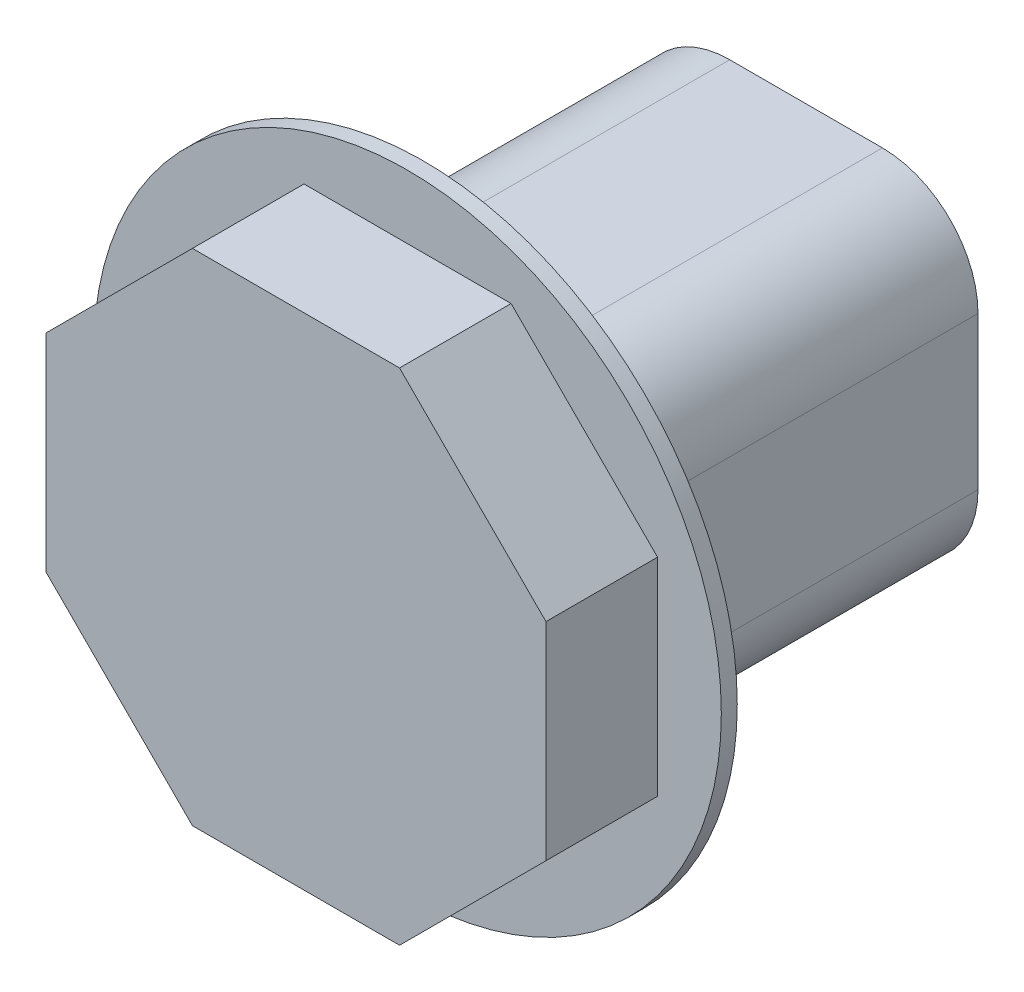
ISO-10303-21;
HEADER;
FILE_DESCRIPTION(('STEP AP214'),'2;1');
FILE_NAME('part.step','',(''),(''),'','','');
FILE_SCHEMA(('AUTOMOTIVE_DESIGN { 1 0 10303 214 1 1 1 1 }'));
ENDSEC;
DATA;
#1=APPLICATION_CONTEXT('core data for automotive mechanical design processes');
#2=APPLICATION_PROTOCOL_DEFINITION('international standard','automotive_design',2000,#1);
#3=PRODUCT_CONTEXT('',#1,'mechanical');
#4=PRODUCT('Part','Part','',(#3));
#5=PRODUCT_RELATED_PRODUCT_CATEGORY('part','',(#4));
#6=PRODUCT_DEFINITION_FORMATION('','',#4);
#7=PRODUCT_DEFINITION_CONTEXT('part definition',#1,'design');
#8=PRODUCT_DEFINITION('design','',#6,#7);
#9=PRODUCT_DEFINITION_SHAPE('','',#8);
#10=(LENGTH_UNIT() NAMED_UNIT(*) SI_UNIT(.MILLI.,.METRE.));
#11=(NAMED_UNIT(*) PLANE_ANGLE_UNIT() SI_UNIT($,.RADIAN.));
#12=(NAMED_UNIT(*) SI_UNIT($,.STERADIAN.) SOLID_ANGLE_UNIT());
#13=UNCERTAINTY_MEASURE_WITH_UNIT(LENGTH_MEASURE(1.E-05),#10,'distance_accuracy_value','');
#14=(GEOMETRIC_REPRESENTATION_CONTEXT(3) GLOBAL_UNCERTAINTY_ASSIGNED_CONTEXT((#13)) GLOBAL_UNIT_ASSIGNED_CONTEXT((#10,
#11,#12)) REPRESENTATION_CONTEXT('',''));
#15=CARTESIAN_POINT('',(0.,0.,0.));
#16=DIRECTION('',(0.,0.,1.));
#17=DIRECTION('',(1.,0.,0.));
#18=AXIS2_PLACEMENT_3D('',#15,#16,#17);
#19=CARTESIAN_POINT('',(274.004074779306,-274.004074779306,-609.6));
#20=DIRECTION('',(-1.,0.,0.));
#21=DIRECTION('',(0.,0.,1.));
#22=AXIS2_PLACEMENT_3D('',#19,#20,#21);
#23=PLANE('',#22);
#24=DIRECTION('',(0.,-1.,0.));
#25=VECTOR('',#24,1.);
#26=CARTESIAN_POINT('',(274.004074779306,-274.004074779306,-609.6));
#27=LINE('',#26,#25);
#28=CARTESIAN_POINT('',(274.004074779306,121.604074779306,-609.6));
#29=VERTEX_POINT('',#28);
#30=CARTESIAN_POINT('',(274.004074779306,-121.604074779306,-609.6));
#31=VERTEX_POINT('',#30);
#32=EDGE_CURVE('E144',#29,#31,#27,.T.);
#33=ORIENTED_EDGE('',*,*,#32,.F.);
#34=DIRECTION('',(0.,0.,1.));
#35=VECTOR('',#34,1.);
#36=CARTESIAN_POINT('',(274.004074779306,121.604074779306,-609.6));
#37=LINE('',#36,#35);
#38=CARTESIAN_POINT('',(274.004074779306,121.604074779306,0.));
#39=VERTEX_POINT('',#38);
#40=EDGE_CURVE('E128',#29,#39,#37,.T.);
#41=ORIENTED_EDGE('',*,*,#40,.T.);
#42=DIRECTION('',(0.,-1.,0.));
#43=VECTOR('',#42,1.);
#44=CARTESIAN_POINT('',(274.004074779306,-274.004074779306,0.));
#45=LINE('',#44,#43);
#46=CARTESIAN_POINT('',(274.004074779306,-121.604074779306,0.));
#47=VERTEX_POINT('',#46);
#48=EDGE_CURVE('E141',#39,#47,#45,.T.);
#49=ORIENTED_EDGE('',*,*,#48,.T.);
#50=DIRECTION('',(0.,0.,1.));
#51=VECTOR('',#50,1.);
#52=CARTESIAN_POINT('',(274.004074779306,-121.604074779306,-609.6));
#53=LINE('',#52,#51);
#54=EDGE_CURVE('E147',#47,#31,#53,.F.);
#55=ORIENTED_EDGE('',*,*,#54,.T.);
#56=EDGE_LOOP('',(#33,#41,#49,#55));
#57=FACE_BOUND('',#56,.T.);
#58=ADVANCED_FACE('F57',(#57),#23,.F.);
#59=CARTESIAN_POINT('',(-274.004074779306,-274.004074779306,-609.6));
#60=DIRECTION('',(0.,1.,0.));
#61=DIRECTION('',(0.,0.,1.));
#62=AXIS2_PLACEMENT_3D('',#59,#60,#61);
#63=PLANE('',#62);
#64=DIRECTION('',(-1.,0.,0.));
#65=VECTOR('',#64,1.);
#66=CARTESIAN_POINT('',(-274.004074779306,-274.004074779306,0.));
#67=LINE('',#66,#65);
#68=CARTESIAN_POINT('',(121.604074779306,-274.004074779306,0.));
#69=VERTEX_POINT('',#68);
#70=CARTESIAN_POINT('',(-121.604074779306,-274.004074779306,0.));
#71=VERTEX_POINT('',#70);
#72=EDGE_CURVE('E152',#69,#71,#67,.T.);
#73=ORIENTED_EDGE('',*,*,#72,.T.);
#74=DIRECTION('',(0.,0.,1.));
#75=VECTOR('',#74,1.);
#76=CARTESIAN_POINT('',(-121.604074779306,-274.004074779306,-609.6));
#77=LINE('',#76,#75);
#78=CARTESIAN_POINT('',(-121.604074779306,-274.004074779306,-609.6));
#79=VERTEX_POINT('',#78);
#80=EDGE_CURVE('E12',#71,#79,#77,.F.);
#81=ORIENTED_EDGE('',*,*,#80,.T.);
#82=DIRECTION('',(-1.,0.,0.));
#83=VECTOR('',#82,1.);
#84=CARTESIAN_POINT('',(-274.004074779306,-274.004074779306,-609.6));
#85=LINE('',#84,#83);
#86=CARTESIAN_POINT('',(121.604074779306,-274.004074779306,-609.6));
#87=VERTEX_POINT('',#86);
#88=EDGE_CURVE('E204',#87,#79,#85,.T.);
#89=ORIENTED_EDGE('',*,*,#88,.F.);
#90=DIRECTION('',(0.,0.,1.));
#91=VECTOR('',#90,1.);
#92=CARTESIAN_POINT('',(121.604074779306,-274.004074779306,-609.6));
#93=LINE('',#92,#91);
#94=EDGE_CURVE('E66',#87,#69,#93,.T.);
#95=ORIENTED_EDGE('',*,*,#94,.T.);
#96=EDGE_LOOP('',(#73,#81,#89,#95));
#97=FACE_BOUND('',#96,.T.);
#98=ADVANCED_FACE('F202',(#97),#63,.F.);
#99=CARTESIAN_POINT('',(-274.004074779306,-274.004074779306,-609.6));
#100=DIRECTION('',(1.,0.,0.));
#101=DIRECTION('',(0.,0.,-1.));
#102=AXIS2_PLACEMENT_3D('',#99,#100,#101);
#103=PLANE('',#102);
#104=DIRECTION('',(0.,1.,0.));
#105=VECTOR('',#104,1.);
#106=CARTESIAN_POINT('',(-274.004074779306,-274.004074779306,0.));
#107=LINE('',#106,#105);
#108=CARTESIAN_POINT('',(-274.004074779306,-121.604074779306,0.));
#109=VERTEX_POINT('',#108);
#110=CARTESIAN_POINT('',(-274.004074779306,121.604074779306,0.));
#111=VERTEX_POINT('',#110);
#112=EDGE_CURVE('E156',#109,#111,#107,.T.);
#113=ORIENTED_EDGE('',*,*,#112,.T.);
#114=DIRECTION('',(0.,0.,1.));
#115=VECTOR('',#114,1.);
#116=CARTESIAN_POINT('',(-274.004074779306,121.604074779306,-609.6));
#117=LINE('',#116,#115);
#118=CARTESIAN_POINT('',(-274.004074779306,121.604074779306,-609.6));
#119=VERTEX_POINT('',#118);
#120=EDGE_CURVE('E73',#111,#119,#117,.F.);
#121=ORIENTED_EDGE('',*,*,#120,.T.);
#122=DIRECTION('',(0.,1.,0.));
#123=VECTOR('',#122,1.);
#124=CARTESIAN_POINT('',(-274.004074779306,-274.004074779306,-609.6));
#125=LINE('',#124,#123);
#126=CARTESIAN_POINT('',(-274.004074779306,-121.604074779306,-609.6));
#127=VERTEX_POINT('',#126);
#128=EDGE_CURVE('E212',#127,#119,#125,.T.);
#129=ORIENTED_EDGE('',*,*,#128,.F.);
#130=DIRECTION('',(0.,0.,1.));
#131=VECTOR('',#130,1.);
#132=CARTESIAN_POINT('',(-274.004074779306,-121.604074779306,-609.6));
#133=LINE('',#132,#131);
#134=EDGE_CURVE('E192',#127,#109,#133,.T.);
#135=ORIENTED_EDGE('',*,*,#134,.T.);
#136=EDGE_LOOP('',(#113,#121,#129,#135));
#137=FACE_BOUND('',#136,.T.);
#138=ADVANCED_FACE('F211',(#137),#103,.F.);
#139=CARTESIAN_POINT('',(-274.004074779306,274.004074779306,-609.6));
#140=DIRECTION('',(0.,-1.,0.));
#141=DIRECTION('',(0.,0.,-1.));
#142=AXIS2_PLACEMENT_3D('',#139,#140,#141);
#143=PLANE('',#142);
#144=DIRECTION('',(1.,0.,0.));
#145=VECTOR('',#144,1.);
#146=CARTESIAN_POINT('',(-274.004074779306,274.004074779306,0.));
#147=LINE('',#146,#145);
#148=CARTESIAN_POINT('',(-121.604074779306,274.004074779306,0.));
#149=VERTEX_POINT('',#148);
#150=CARTESIAN_POINT('',(121.604074779306,274.004074779306,0.));
#151=VERTEX_POINT('',#150);
#152=EDGE_CURVE('E164',#149,#151,#147,.T.);
#153=ORIENTED_EDGE('',*,*,#152,.T.);
#154=DIRECTION('',(0.,0.,1.));
#155=VECTOR('',#154,1.);
#156=CARTESIAN_POINT('',(121.604074779306,274.004074779306,-609.6));
#157=LINE('',#156,#155);
#158=CARTESIAN_POINT('',(121.604074779306,274.004074779306,-609.6));
#159=VERTEX_POINT('',#158);
#160=EDGE_CURVE('E129',#151,#159,#157,.F.);
#161=ORIENTED_EDGE('',*,*,#160,.T.);
#162=DIRECTION('',(1.,0.,0.));
#163=VECTOR('',#162,1.);
#164=CARTESIAN_POINT('',(-274.004074779306,274.004074779306,-609.6));
#165=LINE('',#164,#163);
#166=CARTESIAN_POINT('',(-121.604074779306,274.004074779306,-609.6));
#167=VERTEX_POINT('',#166);
#168=EDGE_CURVE('E159',#167,#159,#165,.T.);
#169=ORIENTED_EDGE('',*,*,#168,.F.);
#170=DIRECTION('',(0.,0.,1.));
#171=VECTOR('',#170,1.);
#172=CARTESIAN_POINT('',(-121.604074779306,274.004074779306,-609.6));
#173=LINE('',#172,#171);
#174=EDGE_CURVE('E135',#167,#149,#173,.T.);
#175=ORIENTED_EDGE('',*,*,#174,.T.);
#176=EDGE_LOOP('',(#153,#161,#169,#175));
#177=FACE_BOUND('',#176,.T.);
#178=ADVANCED_FACE('F244',(#177),#143,.F.);
#179=CARTESIAN_POINT('',(0.,0.,-609.6));
#180=DIRECTION('',(0.,0.,-1.));
#181=DIRECTION('',(-1.,0.,0.));
#182=AXIS2_PLACEMENT_3D('',#179,#180,#181);
#183=PLANE('',#182);
#184=ORIENTED_EDGE('',*,*,#168,.T.);
#185=CARTESIAN_POINT('',(121.604074779306,121.604074779306,-609.6));
#186=DIRECTION('',(0.,0.,-1.));
#187=DIRECTION('',(-1.,0.,0.));
#188=AXIS2_PLACEMENT_3D('',#185,#186,#187);
#189=CIRCLE('',#188,152.4);
#190=EDGE_CURVE('E189',#159,#29,#189,.T.);
#191=ORIENTED_EDGE('',*,*,#190,.T.);
#192=ORIENTED_EDGE('',*,*,#32,.T.);
#193=CARTESIAN_POINT('',(121.604074779306,-121.604074779306,-609.6));
#194=DIRECTION('',(0.,0.,-1.));
#195=DIRECTION('',(-1.,0.,0.));
#196=AXIS2_PLACEMENT_3D('',#193,#194,#195);
#197=CIRCLE('',#196,152.4);
#198=EDGE_CURVE('E181',#31,#87,#197,.T.);
#199=ORIENTED_EDGE('',*,*,#198,.T.);
#200=ORIENTED_EDGE('',*,*,#88,.T.);
#201=CARTESIAN_POINT('',(-121.604074779306,-121.604074779306,-609.6));
#202=DIRECTION('',(0.,0.,-1.));
#203=DIRECTION('',(-1.,0.,0.));
#204=AXIS2_PLACEMENT_3D('',#201,#202,#203);
#205=CIRCLE('',#204,152.4);
#206=EDGE_CURVE('E80',#79,#127,#205,.T.);
#207=ORIENTED_EDGE('',*,*,#206,.T.);
#208=ORIENTED_EDGE('',*,*,#128,.T.);
#209=CARTESIAN_POINT('',(-121.604074779306,121.604074779306,-609.6));
#210=DIRECTION('',(0.,0.,-1.));
#211=DIRECTION('',(-1.,0.,0.));
#212=AXIS2_PLACEMENT_3D('',#209,#210,#211);
#213=CIRCLE('',#212,152.4);
#214=EDGE_CURVE('E186',#119,#167,#213,.T.);
#215=ORIENTED_EDGE('',*,*,#214,.T.);
#216=EDGE_LOOP('',(#184,#191,#192,#199,#200,#207,#208,#215));
#217=FACE_BOUND('',#216,.T.);
#218=ADVANCED_FACE('F221',(#217),#183,.T.);
#219=CARTESIAN_POINT('',(0.,0.,0.));
#220=DIRECTION('',(0.,0.,-1.));
#221=DIRECTION('',(-1.,0.,0.));
#222=AXIS2_PLACEMENT_3D('',#219,#220,#221);
#223=PLANE('',#222);
#224=ORIENTED_EDGE('',*,*,#48,.F.);
#225=CARTESIAN_POINT('',(121.604074779306,121.604074779306,0.));
#226=DIRECTION('',(0.,0.,-1.));
#227=DIRECTION('',(-1.,0.,0.));
#228=AXIS2_PLACEMENT_3D('',#225,#226,#227);
#229=CIRCLE('',#228,152.4);
#230=EDGE_CURVE('E124',#39,#151,#229,.F.);
#231=ORIENTED_EDGE('',*,*,#230,.T.);
#232=ORIENTED_EDGE('',*,*,#152,.F.);
#233=CARTESIAN_POINT('',(-121.604074779306,121.604074779306,0.));
#234=DIRECTION('',(0.,0.,-1.));
#235=DIRECTION('',(-1.,0.,0.));
#236=AXIS2_PLACEMENT_3D('',#233,#234,#235);
#237=CIRCLE('',#236,152.4);
#238=EDGE_CURVE('E136',#149,#111,#237,.F.);
#239=ORIENTED_EDGE('',*,*,#238,.T.);
#240=ORIENTED_EDGE('',*,*,#112,.F.);
#241=CARTESIAN_POINT('',(-121.604074779306,-121.604074779306,0.));
#242=DIRECTION('',(0.,0.,-1.));
#243=DIRECTION('',(-1.,0.,0.));
#244=AXIS2_PLACEMENT_3D('',#241,#242,#243);
#245=CIRCLE('',#244,152.4);
#246=EDGE_CURVE('E171',#109,#71,#245,.F.);
#247=ORIENTED_EDGE('',*,*,#246,.T.);
#248=ORIENTED_EDGE('',*,*,#72,.F.);
#249=CARTESIAN_POINT('',(121.604074779306,-121.604074779306,0.));
#250=DIRECTION('',(0.,0.,-1.));
#251=DIRECTION('',(-1.,0.,0.));
#252=AXIS2_PLACEMENT_3D('',#249,#250,#251);
#253=CIRCLE('',#252,152.4);
#254=EDGE_CURVE('E146',#69,#47,#253,.F.);
#255=ORIENTED_EDGE('',*,*,#254,.T.);
#256=EDGE_LOOP('',(#224,#231,#232,#239,#240,#247,#248,#255));
#257=FACE_BOUND('',#256,.T.);
#258=ADVANCED_FACE('F149',(#257),#223,.F.);
#259=CARTESIAN_POINT('',(121.604074779306,121.604074779306,-609.6));
#260=DIRECTION('',(0.,0.,1.));
#261=DIRECTION('',(1.,0.,0.));
#262=AXIS2_PLACEMENT_3D('',#259,#260,#261);
#263=CYLINDRICAL_SURFACE('',#262,152.4);
#264=ORIENTED_EDGE('',*,*,#190,.F.);
#265=ORIENTED_EDGE('',*,*,#160,.F.);
#266=ORIENTED_EDGE('',*,*,#230,.F.);
#267=ORIENTED_EDGE('',*,*,#40,.F.);
#268=EDGE_LOOP('',(#264,#265,#266,#267));
#269=FACE_BOUND('',#268,.T.);
#270=ADVANCED_FACE('F127',(#269),#263,.T.);
#271=CARTESIAN_POINT('',(-121.604074779306,121.604074779306,-609.6));
#272=DIRECTION('',(0.,0.,1.));
#273=DIRECTION('',(1.,0.,0.));
#274=AXIS2_PLACEMENT_3D('',#271,#272,#273);
#275=CYLINDRICAL_SURFACE('',#274,152.4);
#276=ORIENTED_EDGE('',*,*,#214,.F.);
#277=ORIENTED_EDGE('',*,*,#120,.F.);
#278=ORIENTED_EDGE('',*,*,#238,.F.);
#279=ORIENTED_EDGE('',*,*,#174,.F.);
#280=EDGE_LOOP('',(#276,#277,#278,#279));
#281=FACE_BOUND('',#280,.T.);
#282=ADVANCED_FACE('F226',(#281),#275,.T.);
#283=CARTESIAN_POINT('',(-121.604074779306,-121.604074779306,-609.6));
#284=DIRECTION('',(0.,0.,1.));
#285=DIRECTION('',(1.,0.,0.));
#286=AXIS2_PLACEMENT_3D('',#283,#284,#285);
#287=CYLINDRICAL_SURFACE('',#286,152.4);
#288=ORIENTED_EDGE('',*,*,#206,.F.);
#289=ORIENTED_EDGE('',*,*,#80,.F.);
#290=ORIENTED_EDGE('',*,*,#246,.F.);
#291=ORIENTED_EDGE('',*,*,#134,.F.);
#292=EDGE_LOOP('',(#288,#289,#290,#291));
#293=FACE_BOUND('',#292,.T.);
#294=ADVANCED_FACE('F210',(#293),#287,.T.);
#295=CARTESIAN_POINT('',(121.604074779306,-121.604074779306,-609.6));
#296=DIRECTION('',(0.,0.,1.));
#297=DIRECTION('',(1.,0.,0.));
#298=AXIS2_PLACEMENT_3D('',#295,#296,#297);
#299=CYLINDRICAL_SURFACE('',#298,152.4);
#300=ORIENTED_EDGE('',*,*,#198,.F.);
#301=ORIENTED_EDGE('',*,*,#54,.F.);
#302=ORIENTED_EDGE('',*,*,#254,.F.);
#303=ORIENTED_EDGE('',*,*,#94,.F.);
#304=EDGE_LOOP('',(#300,#301,#302,#303));
#305=FACE_BOUND('',#304,.T.);
#306=ADVANCED_FACE('F59',(#305),#299,.T.);
#307=CLOSED_SHELL('',(#58,#98,#138,#178,#218,#258,#270,#282,#294,#306));
#308=MANIFOLD_SOLID_BREP('B2',#307);
#309=CARTESIAN_POINT('',(398.358671467173,0.,203.2));
#310=DIRECTION('',(-1.,0.,0.));
#311=DIRECTION('',(0.,0.,1.));
#312=AXIS2_PLACEMENT_3D('',#309,#310,#311);
#313=PLANE('',#312);
#314=DIRECTION('',(0.,0.,-1.));
#315=VECTOR('',#314,1.);
#316=CARTESIAN_POINT('',(398.358671467173,-165.005564410631,203.2));
#317=LINE('',#316,#315);
#318=CARTESIAN_POINT('',(398.358671467173,-165.005564410631,203.2));
#319=VERTEX_POINT('',#318);
#320=CARTESIAN_POINT('',(398.358671467173,-165.005564410631,25.4));
#321=VERTEX_POINT('',#320);
#322=EDGE_CURVE('E406',#319,#321,#317,.T.);
#323=ORIENTED_EDGE('',*,*,#322,.T.);
#324=DIRECTION('',(0.,1.,0.));
#325=VECTOR('',#324,1.);
#326=CARTESIAN_POINT('',(398.358671467173,-165.005564410631,25.4));
#327=LINE('',#326,#325);
#328=CARTESIAN_POINT('',(398.358671467173,165.005564410631,25.4));
#329=VERTEX_POINT('',#328);
#330=EDGE_CURVE('E323',#321,#329,#327,.T.);
#331=ORIENTED_EDGE('',*,*,#330,.T.);
#332=DIRECTION('',(0.,0.,-1.));
#333=VECTOR('',#332,1.);
#334=CARTESIAN_POINT('',(398.358671467173,165.005564410631,203.2));
#335=LINE('',#334,#333);
#336=CARTESIAN_POINT('',(398.358671467173,165.005564410631,203.2));
#337=VERTEX_POINT('',#336);
#338=EDGE_CURVE('E55',#337,#329,#335,.T.);
#339=ORIENTED_EDGE('',*,*,#338,.F.);
#340=DIRECTION('',(0.,1.,0.));
#341=VECTOR('',#340,1.);
#342=CARTESIAN_POINT('',(398.358671467173,0.,203.2));
#343=LINE('',#342,#341);
#344=EDGE_CURVE('E421',#319,#337,#343,.T.);
#345=ORIENTED_EDGE('',*,*,#344,.F.);
#346=EDGE_LOOP('',(#323,#331,#339,#345));
#347=FACE_BOUND('',#346,.T.);
#348=ADVANCED_FACE('F309',(#347),#313,.F.);
#349=CARTESIAN_POINT('',(281.682117938902,281.682117938902,203.2));
#350=DIRECTION('',(-0.707106781186548,-0.707106781186548,0.));
#351=DIRECTION('',(0.707106781186548,-0.707106781186548,0.));
#352=AXIS2_PLACEMENT_3D('',#349,#350,#351);
#353=PLANE('',#352);
#354=ORIENTED_EDGE('',*,*,#338,.T.);
#355=DIRECTION('',(-0.707106781186548,0.707106781186548,0.));
#356=VECTOR('',#355,1.);
#357=CARTESIAN_POINT('',(398.358671467173,165.005564410631,25.4));
#358=LINE('',#357,#356);
#359=CARTESIAN_POINT('',(165.005564410631,398.358671467173,25.4));
#360=VERTEX_POINT('',#359);
#361=EDGE_CURVE('E375',#329,#360,#358,.T.);
#362=ORIENTED_EDGE('',*,*,#361,.T.);
#363=DIRECTION('',(0.,0.,-1.));
#364=VECTOR('',#363,1.);
#365=CARTESIAN_POINT('',(165.005564410631,398.358671467173,203.2));
#366=LINE('',#365,#364);
#367=CARTESIAN_POINT('',(165.005564410631,398.358671467173,203.2));
#368=VERTEX_POINT('',#367);
#369=EDGE_CURVE('E316',#368,#360,#366,.T.);
#370=ORIENTED_EDGE('',*,*,#369,.F.);
#371=DIRECTION('',(-0.707106781186548,0.707106781186548,0.));
#372=VECTOR('',#371,1.);
#373=CARTESIAN_POINT('',(281.682117938902,281.682117938902,203.2));
#374=LINE('',#373,#372);
#375=EDGE_CURVE('E419',#337,#368,#374,.T.);
#376=ORIENTED_EDGE('',*,*,#375,.F.);
#377=EDGE_LOOP('',(#354,#362,#370,#376));
#378=FACE_BOUND('',#377,.T.);
#379=ADVANCED_FACE('F385',(#378),#353,.F.);
#380=CARTESIAN_POINT('',(0.,398.358671467173,203.2));
#381=DIRECTION('',(0.,-1.,0.));
#382=DIRECTION('',(0.,0.,-1.));
#383=AXIS2_PLACEMENT_3D('',#380,#381,#382);
#384=PLANE('',#383);
#385=ORIENTED_EDGE('',*,*,#369,.T.);
#386=DIRECTION('',(-1.,0.,0.));
#387=VECTOR('',#386,1.);
#388=CARTESIAN_POINT('',(165.005564410631,398.358671467173,25.4));
#389=LINE('',#388,#387);
#390=CARTESIAN_POINT('',(-165.005564410631,398.358671467173,25.4));
#391=VERTEX_POINT('',#390);
#392=EDGE_CURVE('E372',#360,#391,#389,.T.);
#393=ORIENTED_EDGE('',*,*,#392,.T.);
#394=DIRECTION('',(0.,0.,-1.));
#395=VECTOR('',#394,1.);
#396=CARTESIAN_POINT('',(-165.005564410631,398.358671467173,203.2));
#397=LINE('',#396,#395);
#398=CARTESIAN_POINT('',(-165.005564410631,398.358671467173,203.2));
#399=VERTEX_POINT('',#398);
#400=EDGE_CURVE('E391',#399,#391,#397,.T.);
#401=ORIENTED_EDGE('',*,*,#400,.F.);
#402=DIRECTION('',(-1.,0.,0.));
#403=VECTOR('',#402,1.);
#404=CARTESIAN_POINT('',(0.,398.358671467173,203.2));
#405=LINE('',#404,#403);
#406=EDGE_CURVE('E390',#368,#399,#405,.T.);
#407=ORIENTED_EDGE('',*,*,#406,.F.);
#408=EDGE_LOOP('',(#385,#393,#401,#407));
#409=FACE_BOUND('',#408,.T.);
#410=ADVANCED_FACE('F389',(#409),#384,.F.);
#411=CARTESIAN_POINT('',(-281.682117938902,281.682117938902,203.2));
#412=DIRECTION('',(0.707106781186548,-0.707106781186547,0.));
#413=DIRECTION('',(0.707106781186547,0.707106781186548,0.));
#414=AXIS2_PLACEMENT_3D('',#411,#412,#413);
#415=PLANE('',#414);
#416=ORIENTED_EDGE('',*,*,#400,.T.);
#417=DIRECTION('',(-0.707106781186547,-0.707106781186548,0.));
#418=VECTOR('',#417,1.);
#419=CARTESIAN_POINT('',(-165.005564410631,398.358671467173,25.4));
#420=LINE('',#419,#418);
#421=CARTESIAN_POINT('',(-398.358671467173,165.005564410631,25.4));
#422=VERTEX_POINT('',#421);
#423=EDGE_CURVE('E377',#391,#422,#420,.T.);
#424=ORIENTED_EDGE('',*,*,#423,.T.);
#425=DIRECTION('',(0.,0.,-1.));
#426=VECTOR('',#425,1.);
#427=CARTESIAN_POINT('',(-398.358671467173,165.005564410631,203.2));
#428=LINE('',#427,#426);
#429=CARTESIAN_POINT('',(-398.358671467173,165.005564410631,203.2));
#430=VERTEX_POINT('',#429);
#431=EDGE_CURVE('E392',#430,#422,#428,.T.);
#432=ORIENTED_EDGE('',*,*,#431,.F.);
#433=DIRECTION('',(-0.707106781186547,-0.707106781186548,0.));
#434=VECTOR('',#433,1.);
#435=CARTESIAN_POINT('',(-281.682117938902,281.682117938902,203.2));
#436=LINE('',#435,#434);
#437=EDGE_CURVE('E416',#399,#430,#436,.T.);
#438=ORIENTED_EDGE('',*,*,#437,.F.);
#439=EDGE_LOOP('',(#416,#424,#432,#438));
#440=FACE_BOUND('',#439,.T.);
#441=ADVANCED_FACE('F443',(#440),#415,.F.);
#442=CARTESIAN_POINT('',(-398.358671467173,-1.34015774165447E-13,203.2));
#443=DIRECTION('',(1.,0.,0.));
#444=DIRECTION('',(0.,1.,0.));
#445=AXIS2_PLACEMENT_3D('',#442,#443,#444);
#446=PLANE('',#445);
#447=ORIENTED_EDGE('',*,*,#431,.T.);
#448=DIRECTION('',(0.,-1.,0.));
#449=VECTOR('',#448,1.);
#450=CARTESIAN_POINT('',(-398.358671467173,165.005564410631,25.4));
#451=LINE('',#450,#449);
#452=CARTESIAN_POINT('',(-398.358671467173,-165.005564410631,25.4));
#453=VERTEX_POINT('',#452);
#454=EDGE_CURVE('E438',#422,#453,#451,.T.);
#455=ORIENTED_EDGE('',*,*,#454,.T.);
#456=DIRECTION('',(0.,0.,-1.));
#457=VECTOR('',#456,1.);
#458=CARTESIAN_POINT('',(-398.358671467173,-165.005564410631,203.2));
#459=LINE('',#458,#457);
#460=CARTESIAN_POINT('',(-398.358671467173,-165.005564410631,203.2));
#461=VERTEX_POINT('',#460);
#462=EDGE_CURVE('E397',#461,#453,#459,.T.);
#463=ORIENTED_EDGE('',*,*,#462,.F.);
#464=DIRECTION('',(0.,-1.,0.));
#465=VECTOR('',#464,1.);
#466=CARTESIAN_POINT('',(-398.358671467173,-1.34015774165447E-13,203.2));
#467=LINE('',#466,#465);
#468=EDGE_CURVE('E414',#430,#461,#467,.T.);
#469=ORIENTED_EDGE('',*,*,#468,.F.);
#470=EDGE_LOOP('',(#447,#455,#463,#469));
#471=FACE_BOUND('',#470,.T.);
#472=ADVANCED_FACE('F447',(#471),#446,.F.);
#473=CARTESIAN_POINT('',(-281.682117938902,-281.682117938902,203.2));
#474=DIRECTION('',(0.707106781186547,0.707106781186548,0.));
#475=DIRECTION('',(-0.707106781186548,0.707106781186547,0.));
#476=AXIS2_PLACEMENT_3D('',#473,#474,#475);
#477=PLANE('',#476);
#478=ORIENTED_EDGE('',*,*,#462,.T.);
#479=DIRECTION('',(0.707106781186548,-0.707106781186547,0.));
#480=VECTOR('',#479,1.);
#481=CARTESIAN_POINT('',(-398.358671467173,-165.005564410631,25.4));
#482=LINE('',#481,#480);
#483=CARTESIAN_POINT('',(-165.005564410631,-398.358671467173,25.4));
#484=VERTEX_POINT('',#483);
#485=EDGE_CURVE('E435',#453,#484,#482,.T.);
#486=ORIENTED_EDGE('',*,*,#485,.T.);
#487=DIRECTION('',(0.,0.,-1.));
#488=VECTOR('',#487,1.);
#489=CARTESIAN_POINT('',(-165.005564410631,-398.358671467173,203.2));
#490=LINE('',#489,#488);
#491=CARTESIAN_POINT('',(-165.005564410631,-398.358671467173,203.2));
#492=VERTEX_POINT('',#491);
#493=EDGE_CURVE('E400',#492,#484,#490,.T.);
#494=ORIENTED_EDGE('',*,*,#493,.F.);
#495=DIRECTION('',(0.707106781186548,-0.707106781186547,0.));
#496=VECTOR('',#495,1.);
#497=CARTESIAN_POINT('',(-281.682117938902,-281.682117938902,203.2));
#498=LINE('',#497,#496);
#499=EDGE_CURVE('E412',#461,#492,#498,.T.);
#500=ORIENTED_EDGE('',*,*,#499,.F.);
#501=EDGE_LOOP('',(#478,#486,#494,#500));
#502=FACE_BOUND('',#501,.T.);
#503=ADVANCED_FACE('F461',(#502),#477,.F.);
#504=CARTESIAN_POINT('',(1.34015774165447E-13,-398.358671467173,203.2));
#505=DIRECTION('',(0.,1.,0.));
#506=DIRECTION('',(-1.,0.,0.));
#507=AXIS2_PLACEMENT_3D('',#504,#505,#506);
#508=PLANE('',#507);
#509=ORIENTED_EDGE('',*,*,#493,.T.);
#510=DIRECTION('',(1.,0.,0.));
#511=VECTOR('',#510,1.);
#512=CARTESIAN_POINT('',(-165.005564410631,-398.358671467173,25.4));
#513=LINE('',#512,#511);
#514=CARTESIAN_POINT('',(165.005564410631,-398.358671467173,25.4));
#515=VERTEX_POINT('',#514);
#516=EDGE_CURVE('E432',#484,#515,#513,.T.);
#517=ORIENTED_EDGE('',*,*,#516,.T.);
#518=DIRECTION('',(0.,0.,-1.));
#519=VECTOR('',#518,1.);
#520=CARTESIAN_POINT('',(165.005564410631,-398.358671467173,203.2));
#521=LINE('',#520,#519);
#522=CARTESIAN_POINT('',(165.005564410631,-398.358671467173,203.2));
#523=VERTEX_POINT('',#522);
#524=EDGE_CURVE('E403',#523,#515,#521,.T.);
#525=ORIENTED_EDGE('',*,*,#524,.F.);
#526=DIRECTION('',(1.,0.,0.));
#527=VECTOR('',#526,1.);
#528=CARTESIAN_POINT('',(1.34015774165447E-13,-398.358671467173,203.2));
#529=LINE('',#528,#527);
#530=EDGE_CURVE('E410',#492,#523,#529,.T.);
#531=ORIENTED_EDGE('',*,*,#530,.F.);
#532=EDGE_LOOP('',(#509,#517,#525,#531));
#533=FACE_BOUND('',#532,.T.);
#534=ADVANCED_FACE('F458',(#533),#508,.F.);
#535=CARTESIAN_POINT('',(281.682117938902,-281.682117938902,203.2));
#536=DIRECTION('',(-0.707106781186548,0.707106781186547,0.));
#537=DIRECTION('',(-0.707106781186547,-0.707106781186548,0.));
#538=AXIS2_PLACEMENT_3D('',#535,#536,#537);
#539=PLANE('',#538);
#540=ORIENTED_EDGE('',*,*,#524,.T.);
#541=DIRECTION('',(0.707106781186547,0.707106781186548,0.));
#542=VECTOR('',#541,1.);
#543=CARTESIAN_POINT('',(165.005564410631,-398.358671467173,25.4));
#544=LINE('',#543,#542);
#545=EDGE_CURVE('E430',#515,#321,#544,.T.);
#546=ORIENTED_EDGE('',*,*,#545,.T.);
#547=ORIENTED_EDGE('',*,*,#322,.F.);
#548=DIRECTION('',(0.707106781186547,0.707106781186548,0.));
#549=VECTOR('',#548,1.);
#550=CARTESIAN_POINT('',(281.682117938902,-281.682117938902,203.2));
#551=LINE('',#550,#549);
#552=EDGE_CURVE('E331',#523,#319,#551,.T.);
#553=ORIENTED_EDGE('',*,*,#552,.F.);
#554=EDGE_LOOP('',(#540,#546,#547,#553));
#555=FACE_BOUND('',#554,.T.);
#556=ADVANCED_FACE('F455',(#555),#539,.F.);
#557=CARTESIAN_POINT('',(0.,0.,203.2));
#558=DIRECTION('',(0.,0.,1.));
#559=DIRECTION('',(1.,0.,0.));
#560=AXIS2_PLACEMENT_3D('',#557,#558,#559);
#561=PLANE('',#560);
#562=ORIENTED_EDGE('',*,*,#344,.T.);
#563=ORIENTED_EDGE('',*,*,#375,.T.);
#564=ORIENTED_EDGE('',*,*,#406,.T.);
#565=ORIENTED_EDGE('',*,*,#437,.T.);
#566=ORIENTED_EDGE('',*,*,#468,.T.);
#567=ORIENTED_EDGE('',*,*,#499,.T.);
#568=ORIENTED_EDGE('',*,*,#530,.T.);
#569=ORIENTED_EDGE('',*,*,#552,.T.);
#570=EDGE_LOOP('',(#562,#563,#564,#565,#566,#567,#568,#569));
#571=FACE_BOUND('',#570,.T.);
#572=ADVANCED_FACE('F450',(#571),#561,.T.);
#573=CARTESIAN_POINT('',(0.,0.,25.4));
#574=DIRECTION('',(0.,0.,1.));
#575=DIRECTION('',(1.,0.,0.));
#576=AXIS2_PLACEMENT_3D('',#573,#574,#575);
#577=PLANE('',#576);
#578=CARTESIAN_POINT('',(0.,0.,25.4));
#579=DIRECTION('',(0.,0.,1.));
#580=DIRECTION('',(1.,0.,0.));
#581=AXIS2_PLACEMENT_3D('',#578,#579,#580);
#582=CIRCLE('',#581,500.);
#583=CARTESIAN_POINT('',(500.,0.,25.4));
#584=VERTEX_POINT('',#583);
#585=EDGE_CURVE('E423',#584,#584,#582,.T.);
#586=ORIENTED_EDGE('',*,*,#585,.T.);
#587=EDGE_LOOP('',(#586));
#588=FACE_BOUND('',#587,.T.);
#589=ORIENTED_EDGE('',*,*,#392,.F.);
#590=ORIENTED_EDGE('',*,*,#361,.F.);
#591=ORIENTED_EDGE('',*,*,#330,.F.);
#592=ORIENTED_EDGE('',*,*,#545,.F.);
#593=ORIENTED_EDGE('',*,*,#516,.F.);
#594=ORIENTED_EDGE('',*,*,#485,.F.);
#595=ORIENTED_EDGE('',*,*,#454,.F.);
#596=ORIENTED_EDGE('',*,*,#423,.F.);
#597=EDGE_LOOP('',(#589,#590,#591,#592,#593,#594,#595,#596));
#598=FACE_BOUND('',#597,.T.);
#599=ADVANCED_FACE('F374',(#588,#598),#577,.T.);
#600=CARTESIAN_POINT('',(0.,0.,25.4));
#601=DIRECTION('',(0.,0.,-1.));
#602=DIRECTION('',(-1.,0.,0.));
#603=AXIS2_PLACEMENT_3D('',#600,#601,#602);
#604=CYLINDRICAL_SURFACE('',#603,500.);
#605=ORIENTED_EDGE('',*,*,#585,.F.);
#606=EDGE_LOOP('',(#605));
#607=FACE_BOUND('',#606,.T.);
#608=CARTESIAN_POINT('',(0.,0.,0.));
#609=DIRECTION('',(0.,0.,1.));
#610=DIRECTION('',(1.,0.,0.));
#611=AXIS2_PLACEMENT_3D('',#608,#609,#610);
#612=CIRCLE('',#611,500.);
#613=CARTESIAN_POINT('',(500.,0.,0.));
#614=VERTEX_POINT('',#613);
#615=EDGE_CURVE('E424',#614,#614,#612,.T.);
#616=ORIENTED_EDGE('',*,*,#615,.T.);
#617=EDGE_LOOP('',(#616));
#618=FACE_BOUND('',#617,.T.);
#619=ADVANCED_FACE('F528',(#607,#618),#604,.T.);
#620=CARTESIAN_POINT('',(0.,0.,0.));
#621=DIRECTION('',(0.,0.,1.));
#622=DIRECTION('',(1.,0.,0.));
#623=AXIS2_PLACEMENT_3D('',#620,#621,#622);
#624=PLANE('',#623);
#625=ORIENTED_EDGE('',*,*,#615,.F.);
#626=EDGE_LOOP('',(#625));
#627=FACE_BOUND('',#626,.T.);
#628=ADVANCED_FACE('F522',(#627),#624,.F.);
#629=CLOSED_SHELL('',(#348,#379,#410,#441,#472,#503,#534,#556,#572,#599,#619,#628));
#630=MANIFOLD_SOLID_BREP('B6',#629);
#631=ADVANCED_BREP_SHAPE_REPRESENTATION('',(#18,#308,#630),#14);
#632=SHAPE_DEFINITION_REPRESENTATION(#9,#631);
ENDSEC;
END-ISO-10303-21;
